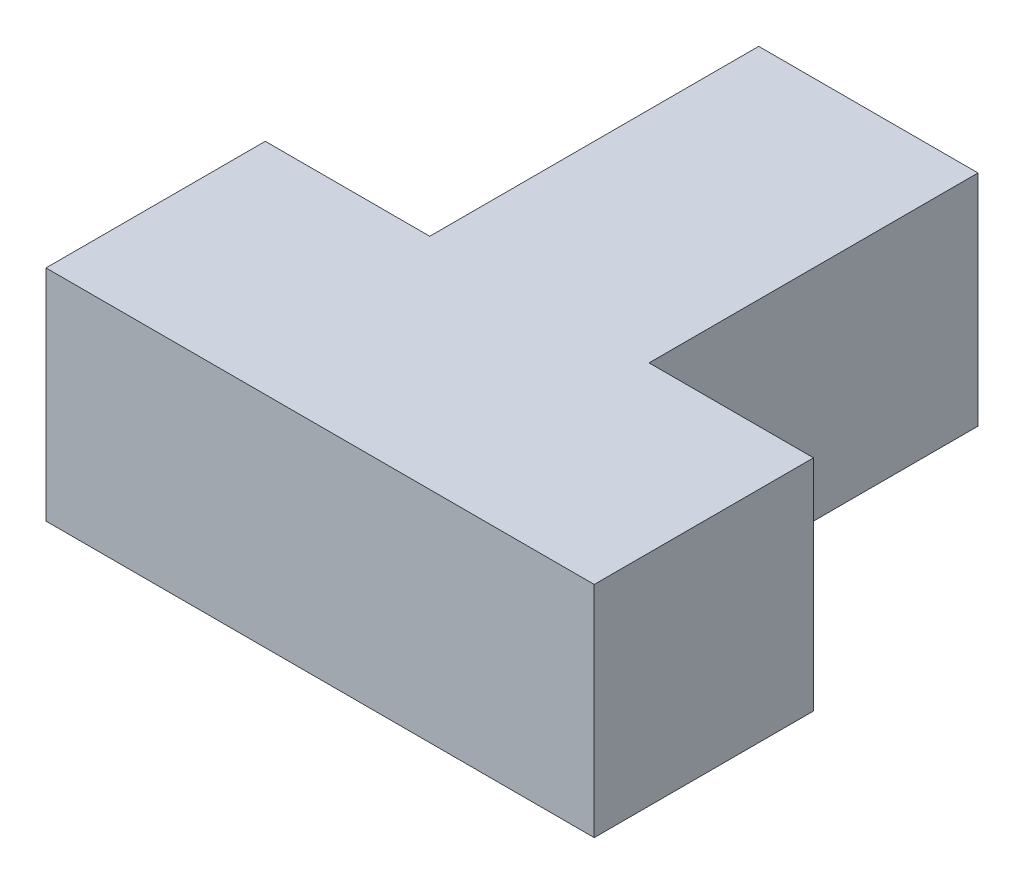
ISO-10303-21;
HEADER;
FILE_DESCRIPTION(('STEP AP214'),'2;1');
FILE_NAME('part.step','',(''),(''),'','','');
FILE_SCHEMA(('AUTOMOTIVE_DESIGN { 1 0 10303 214 1 1 1 1 }'));
ENDSEC;
DATA;
#1=APPLICATION_CONTEXT('core data for automotive mechanical design processes');
#2=APPLICATION_PROTOCOL_DEFINITION('international standard','automotive_design',2000,#1);
#3=PRODUCT_CONTEXT('',#1,'mechanical');
#4=PRODUCT('Part','Part','',(#3));
#5=PRODUCT_RELATED_PRODUCT_CATEGORY('part','',(#4));
#6=PRODUCT_DEFINITION_FORMATION('','',#4);
#7=PRODUCT_DEFINITION_CONTEXT('part definition',#1,'design');
#8=PRODUCT_DEFINITION('design','',#6,#7);
#9=PRODUCT_DEFINITION_SHAPE('','',#8);
#10=(LENGTH_UNIT() NAMED_UNIT(*) SI_UNIT(.MILLI.,.METRE.));
#11=(NAMED_UNIT(*) PLANE_ANGLE_UNIT() SI_UNIT($,.RADIAN.));
#12=(NAMED_UNIT(*) SI_UNIT($,.STERADIAN.) SOLID_ANGLE_UNIT());
#13=UNCERTAINTY_MEASURE_WITH_UNIT(LENGTH_MEASURE(1.E-05),#10,'distance_accuracy_value','');
#14=(GEOMETRIC_REPRESENTATION_CONTEXT(3) GLOBAL_UNCERTAINTY_ASSIGNED_CONTEXT((#13)) GLOBAL_UNIT_ASSIGNED_CONTEXT((#10,
#11,#12)) REPRESENTATION_CONTEXT('',''));
#15=CARTESIAN_POINT('',(0.,0.,0.));
#16=DIRECTION('',(0.,0.,1.));
#17=DIRECTION('',(1.,0.,0.));
#18=AXIS2_PLACEMENT_3D('',#15,#16,#17);
#19=CARTESIAN_POINT('',(-25.,20.,25.));
#20=DIRECTION('',(1.,0.,0.));
#21=DIRECTION('',(0.,0.,-1.));
#22=AXIS2_PLACEMENT_3D('',#19,#20,#21);
#23=PLANE('',#22);
#24=DIRECTION('',(0.,0.,1.));
#25=VECTOR('',#24,1.);
#26=CARTESIAN_POINT('',(-25.,0.,25.));
#27=LINE('',#26,#25);
#28=CARTESIAN_POINT('',(-25.,0.,5.));
#29=VERTEX_POINT('',#28);
#30=CARTESIAN_POINT('',(-25.,0.,25.));
#31=VERTEX_POINT('',#30);
#32=EDGE_CURVE('E132',#29,#31,#27,.T.);
#33=ORIENTED_EDGE('',*,*,#32,.T.);
#34=DIRECTION('',(0.,-1.,0.));
#35=VECTOR('',#34,1.);
#36=CARTESIAN_POINT('',(-25.,20.,25.));
#37=LINE('',#36,#35);
#38=CARTESIAN_POINT('',(-25.,20.,25.));
#39=VERTEX_POINT('',#38);
#40=EDGE_CURVE('E11',#39,#31,#37,.T.);
#41=ORIENTED_EDGE('',*,*,#40,.F.);
#42=DIRECTION('',(0.,0.,1.));
#43=VECTOR('',#42,1.);
#44=CARTESIAN_POINT('',(-25.,20.,25.));
#45=LINE('',#44,#43);
#46=CARTESIAN_POINT('',(-25.,20.,5.));
#47=VERTEX_POINT('',#46);
#48=EDGE_CURVE('E146',#47,#39,#45,.T.);
#49=ORIENTED_EDGE('',*,*,#48,.F.);
#50=DIRECTION('',(0.,-1.,0.));
#51=VECTOR('',#50,1.);
#52=CARTESIAN_POINT('',(-25.,20.,5.));
#53=LINE('',#52,#51);
#54=EDGE_CURVE('E128',#47,#29,#53,.T.);
#55=ORIENTED_EDGE('',*,*,#54,.T.);
#56=EDGE_LOOP('',(#33,#41,#49,#55));
#57=FACE_BOUND('',#56,.T.);
#58=ADVANCED_FACE('F36',(#57),#23,.F.);
#59=CARTESIAN_POINT('',(-25.,20.,25.));
#60=DIRECTION('',(0.,0.,-1.));
#61=DIRECTION('',(-1.,0.,0.));
#62=AXIS2_PLACEMENT_3D('',#59,#60,#61);
#63=PLANE('',#62);
#64=DIRECTION('',(1.,0.,0.));
#65=VECTOR('',#64,1.);
#66=CARTESIAN_POINT('',(-25.,0.,25.));
#67=LINE('',#66,#65);
#68=CARTESIAN_POINT('',(25.,0.,25.));
#69=VERTEX_POINT('',#68);
#70=EDGE_CURVE('E135',#31,#69,#67,.T.);
#71=ORIENTED_EDGE('',*,*,#70,.T.);
#72=DIRECTION('',(0.,-1.,0.));
#73=VECTOR('',#72,1.);
#74=CARTESIAN_POINT('',(25.,20.,25.));
#75=LINE('',#74,#73);
#76=CARTESIAN_POINT('',(25.,20.,25.));
#77=VERTEX_POINT('',#76);
#78=EDGE_CURVE('E44',#77,#69,#75,.T.);
#79=ORIENTED_EDGE('',*,*,#78,.F.);
#80=DIRECTION('',(1.,0.,0.));
#81=VECTOR('',#80,1.);
#82=CARTESIAN_POINT('',(-25.,20.,25.));
#83=LINE('',#82,#81);
#84=EDGE_CURVE('E95',#39,#77,#83,.T.);
#85=ORIENTED_EDGE('',*,*,#84,.F.);
#86=ORIENTED_EDGE('',*,*,#40,.T.);
#87=EDGE_LOOP('',(#71,#79,#85,#86));
#88=FACE_BOUND('',#87,.T.);
#89=ADVANCED_FACE('F181',(#88),#63,.F.);
#90=CARTESIAN_POINT('',(25.,20.,25.));
#91=DIRECTION('',(-1.,0.,0.));
#92=DIRECTION('',(0.,0.,1.));
#93=AXIS2_PLACEMENT_3D('',#90,#91,#92);
#94=PLANE('',#93);
#95=DIRECTION('',(0.,0.,-1.));
#96=VECTOR('',#95,1.);
#97=CARTESIAN_POINT('',(25.,0.,25.));
#98=LINE('',#97,#96);
#99=CARTESIAN_POINT('',(25.,0.,5.));
#100=VERTEX_POINT('',#99);
#101=EDGE_CURVE('E137',#69,#100,#98,.T.);
#102=ORIENTED_EDGE('',*,*,#101,.T.);
#103=DIRECTION('',(0.,-1.,0.));
#104=VECTOR('',#103,1.);
#105=CARTESIAN_POINT('',(25.,20.,5.));
#106=LINE('',#105,#104);
#107=CARTESIAN_POINT('',(25.,20.,5.));
#108=VERTEX_POINT('',#107);
#109=EDGE_CURVE('E153',#108,#100,#106,.T.);
#110=ORIENTED_EDGE('',*,*,#109,.F.);
#111=DIRECTION('',(0.,0.,-1.));
#112=VECTOR('',#111,1.);
#113=CARTESIAN_POINT('',(25.,20.,25.));
#114=LINE('',#113,#112);
#115=EDGE_CURVE('E161',#77,#108,#114,.T.);
#116=ORIENTED_EDGE('',*,*,#115,.F.);
#117=ORIENTED_EDGE('',*,*,#78,.T.);
#118=EDGE_LOOP('',(#102,#110,#116,#117));
#119=FACE_BOUND('',#118,.T.);
#120=ADVANCED_FACE('F159',(#119),#94,.F.);
#121=CARTESIAN_POINT('',(25.,20.,5.));
#122=DIRECTION('',(0.,0.,1.));
#123=DIRECTION('',(1.,0.,0.));
#124=AXIS2_PLACEMENT_3D('',#121,#122,#123);
#125=PLANE('',#124);
#126=DIRECTION('',(-1.,0.,0.));
#127=VECTOR('',#126,1.);
#128=CARTESIAN_POINT('',(25.,0.,5.));
#129=LINE('',#128,#127);
#130=CARTESIAN_POINT('',(10.,0.,5.));
#131=VERTEX_POINT('',#130);
#132=EDGE_CURVE('E139',#100,#131,#129,.T.);
#133=ORIENTED_EDGE('',*,*,#132,.T.);
#134=DIRECTION('',(0.,-1.,0.));
#135=VECTOR('',#134,1.);
#136=CARTESIAN_POINT('',(10.,20.,5.));
#137=LINE('',#136,#135);
#138=CARTESIAN_POINT('',(10.,20.,5.));
#139=VERTEX_POINT('',#138);
#140=EDGE_CURVE('E150',#139,#131,#137,.T.);
#141=ORIENTED_EDGE('',*,*,#140,.F.);
#142=DIRECTION('',(-1.,0.,0.));
#143=VECTOR('',#142,1.);
#144=CARTESIAN_POINT('',(25.,20.,5.));
#145=LINE('',#144,#143);
#146=EDGE_CURVE('E173',#108,#139,#145,.T.);
#147=ORIENTED_EDGE('',*,*,#146,.F.);
#148=ORIENTED_EDGE('',*,*,#109,.T.);
#149=EDGE_LOOP('',(#133,#141,#147,#148));
#150=FACE_BOUND('',#149,.T.);
#151=ADVANCED_FACE('F169',(#150),#125,.F.);
#152=CARTESIAN_POINT('',(10.,20.,-25.));
#153=DIRECTION('',(-1.,0.,0.));
#154=DIRECTION('',(0.,0.,1.));
#155=AXIS2_PLACEMENT_3D('',#152,#153,#154);
#156=PLANE('',#155);
#157=DIRECTION('',(0.,0.,-1.));
#158=VECTOR('',#157,1.);
#159=CARTESIAN_POINT('',(10.,0.,-25.));
#160=LINE('',#159,#158);
#161=CARTESIAN_POINT('',(10.,0.,-25.));
#162=VERTEX_POINT('',#161);
#163=EDGE_CURVE('E141',#131,#162,#160,.T.);
#164=ORIENTED_EDGE('',*,*,#163,.T.);
#165=DIRECTION('',(0.,-1.,0.));
#166=VECTOR('',#165,1.);
#167=CARTESIAN_POINT('',(10.,20.,-25.));
#168=LINE('',#167,#166);
#169=CARTESIAN_POINT('',(10.,20.,-25.));
#170=VERTEX_POINT('',#169);
#171=EDGE_CURVE('E123',#170,#162,#168,.T.);
#172=ORIENTED_EDGE('',*,*,#171,.F.);
#173=DIRECTION('',(0.,0.,-1.));
#174=VECTOR('',#173,1.);
#175=CARTESIAN_POINT('',(10.,20.,-25.));
#176=LINE('',#175,#174);
#177=EDGE_CURVE('E114',#139,#170,#176,.T.);
#178=ORIENTED_EDGE('',*,*,#177,.F.);
#179=ORIENTED_EDGE('',*,*,#140,.T.);
#180=EDGE_LOOP('',(#164,#172,#178,#179));
#181=FACE_BOUND('',#180,.T.);
#182=ADVANCED_FACE('F172',(#181),#156,.F.);
#183=CARTESIAN_POINT('',(-10.,20.,-25.));
#184=DIRECTION('',(0.,0.,1.));
#185=DIRECTION('',(1.,0.,0.));
#186=AXIS2_PLACEMENT_3D('',#183,#184,#185);
#187=PLANE('',#186);
#188=DIRECTION('',(-1.,0.,0.));
#189=VECTOR('',#188,1.);
#190=CARTESIAN_POINT('',(-10.,0.,-25.));
#191=LINE('',#190,#189);
#192=CARTESIAN_POINT('',(-10.,0.,-25.));
#193=VERTEX_POINT('',#192);
#194=EDGE_CURVE('E122',#162,#193,#191,.T.);
#195=ORIENTED_EDGE('',*,*,#194,.T.);
#196=DIRECTION('',(0.,-1.,0.));
#197=VECTOR('',#196,1.);
#198=CARTESIAN_POINT('',(-10.,20.,-25.));
#199=LINE('',#198,#197);
#200=CARTESIAN_POINT('',(-10.,20.,-25.));
#201=VERTEX_POINT('',#200);
#202=EDGE_CURVE('E119',#201,#193,#199,.T.);
#203=ORIENTED_EDGE('',*,*,#202,.F.);
#204=DIRECTION('',(-1.,0.,0.));
#205=VECTOR('',#204,1.);
#206=CARTESIAN_POINT('',(-10.,20.,-25.));
#207=LINE('',#206,#205);
#208=EDGE_CURVE('E108',#170,#201,#207,.T.);
#209=ORIENTED_EDGE('',*,*,#208,.F.);
#210=ORIENTED_EDGE('',*,*,#171,.T.);
#211=EDGE_LOOP('',(#195,#203,#209,#210));
#212=FACE_BOUND('',#211,.T.);
#213=ADVANCED_FACE('F120',(#212),#187,.F.);
#214=CARTESIAN_POINT('',(-10.,20.,-25.));
#215=DIRECTION('',(1.,0.,0.));
#216=DIRECTION('',(0.,0.,-1.));
#217=AXIS2_PLACEMENT_3D('',#214,#215,#216);
#218=PLANE('',#217);
#219=DIRECTION('',(0.,0.,1.));
#220=VECTOR('',#219,1.);
#221=CARTESIAN_POINT('',(-10.,0.,-25.));
#222=LINE('',#221,#220);
#223=CARTESIAN_POINT('',(-10.,0.,5.));
#224=VERTEX_POINT('',#223);
#225=EDGE_CURVE('E81',#193,#224,#222,.T.);
#226=ORIENTED_EDGE('',*,*,#225,.T.);
#227=DIRECTION('',(0.,-1.,0.));
#228=VECTOR('',#227,1.);
#229=CARTESIAN_POINT('',(-10.,20.,5.));
#230=LINE('',#229,#228);
#231=CARTESIAN_POINT('',(-10.,20.,5.));
#232=VERTEX_POINT('',#231);
#233=EDGE_CURVE('E124',#232,#224,#230,.T.);
#234=ORIENTED_EDGE('',*,*,#233,.F.);
#235=DIRECTION('',(0.,0.,1.));
#236=VECTOR('',#235,1.);
#237=CARTESIAN_POINT('',(-10.,20.,-25.));
#238=LINE('',#237,#236);
#239=EDGE_CURVE('E112',#201,#232,#238,.T.);
#240=ORIENTED_EDGE('',*,*,#239,.F.);
#241=ORIENTED_EDGE('',*,*,#202,.T.);
#242=EDGE_LOOP('',(#226,#234,#240,#241));
#243=FACE_BOUND('',#242,.T.);
#244=ADVANCED_FACE('F126',(#243),#218,.F.);
#245=CARTESIAN_POINT('',(-25.,20.,5.));
#246=DIRECTION('',(0.,0.,1.));
#247=DIRECTION('',(1.,0.,0.));
#248=AXIS2_PLACEMENT_3D('',#245,#246,#247);
#249=PLANE('',#248);
#250=DIRECTION('',(-1.,0.,0.));
#251=VECTOR('',#250,1.);
#252=CARTESIAN_POINT('',(-25.,0.,5.));
#253=LINE('',#252,#251);
#254=EDGE_CURVE('E87',#224,#29,#253,.T.);
#255=ORIENTED_EDGE('',*,*,#254,.T.);
#256=ORIENTED_EDGE('',*,*,#54,.F.);
#257=DIRECTION('',(-1.,0.,0.));
#258=VECTOR('',#257,1.);
#259=CARTESIAN_POINT('',(-25.,20.,5.));
#260=LINE('',#259,#258);
#261=EDGE_CURVE('E52',#232,#47,#260,.T.);
#262=ORIENTED_EDGE('',*,*,#261,.F.);
#263=ORIENTED_EDGE('',*,*,#233,.T.);
#264=EDGE_LOOP('',(#255,#256,#262,#263));
#265=FACE_BOUND('',#264,.T.);
#266=ADVANCED_FACE('F197',(#265),#249,.F.);
#267=CARTESIAN_POINT('',(0.,20.,0.));
#268=DIRECTION('',(0.,-1.,0.));
#269=DIRECTION('',(0.,0.,-1.));
#270=AXIS2_PLACEMENT_3D('',#267,#268,#269);
#271=PLANE('',#270);
#272=ORIENTED_EDGE('',*,*,#48,.T.);
#273=ORIENTED_EDGE('',*,*,#84,.T.);
#274=ORIENTED_EDGE('',*,*,#115,.T.);
#275=ORIENTED_EDGE('',*,*,#146,.T.);
#276=ORIENTED_EDGE('',*,*,#177,.T.);
#277=ORIENTED_EDGE('',*,*,#208,.T.);
#278=ORIENTED_EDGE('',*,*,#239,.T.);
#279=ORIENTED_EDGE('',*,*,#261,.T.);
#280=EDGE_LOOP('',(#272,#273,#274,#275,#276,#277,#278,#279));
#281=FACE_BOUND('',#280,.T.);
#282=ADVANCED_FACE('F110',(#281),#271,.F.);
#283=CARTESIAN_POINT('',(0.,0.,0.));
#284=DIRECTION('',(0.,-1.,0.));
#285=DIRECTION('',(0.,0.,-1.));
#286=AXIS2_PLACEMENT_3D('',#283,#284,#285);
#287=PLANE('',#286);
#288=ORIENTED_EDGE('',*,*,#32,.F.);
#289=ORIENTED_EDGE('',*,*,#254,.F.);
#290=ORIENTED_EDGE('',*,*,#225,.F.);
#291=ORIENTED_EDGE('',*,*,#194,.F.);
#292=ORIENTED_EDGE('',*,*,#163,.F.);
#293=ORIENTED_EDGE('',*,*,#132,.F.);
#294=ORIENTED_EDGE('',*,*,#101,.F.);
#295=ORIENTED_EDGE('',*,*,#70,.F.);
#296=EDGE_LOOP('',(#288,#289,#290,#291,#292,#293,#294,#295));
#297=FACE_BOUND('',#296,.T.);
#298=ADVANCED_FACE('F165',(#297),#287,.T.);
#299=CLOSED_SHELL('',(#58,#89,#120,#151,#182,#213,#244,#266,#282,#298));
#300=MANIFOLD_SOLID_BREP('B2',#299);
#301=ADVANCED_BREP_SHAPE_REPRESENTATION('',(#18,#300),#14);
#302=SHAPE_DEFINITION_REPRESENTATION(#9,#301);
ENDSEC;
END-ISO-10303-21;
